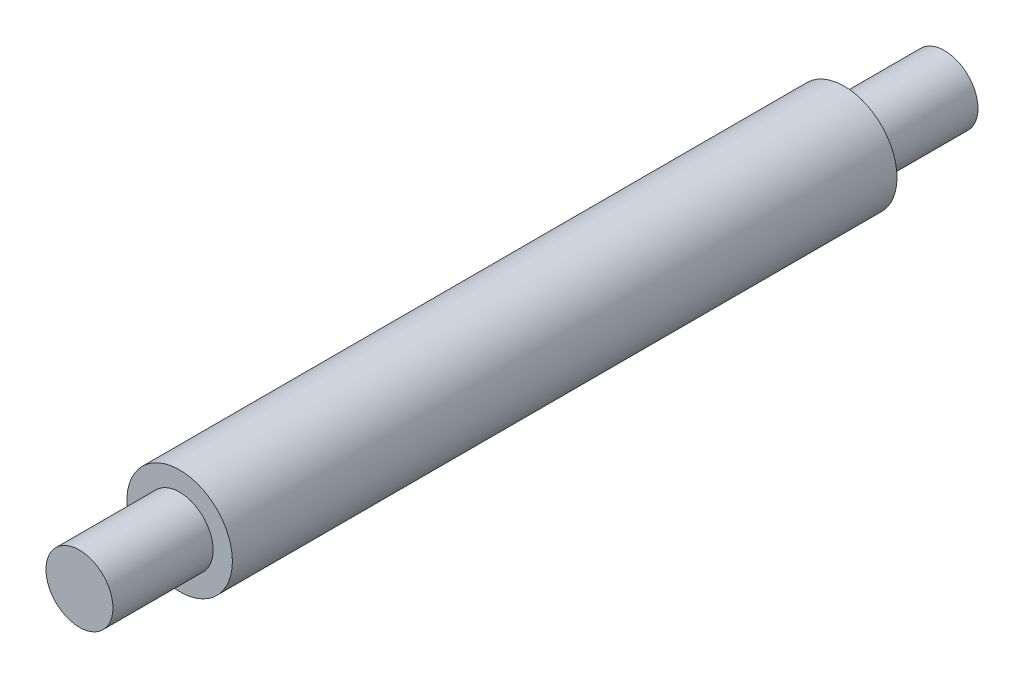
ISO-10303-21;
HEADER;
FILE_DESCRIPTION(('STEP AP214'),'2;1');
FILE_NAME('part.step','',(''),(''),'','','');
FILE_SCHEMA(('AUTOMOTIVE_DESIGN { 1 0 10303 214 1 1 1 1 }'));
ENDSEC;
DATA;
#1=APPLICATION_CONTEXT('core data for automotive mechanical design processes');
#2=APPLICATION_PROTOCOL_DEFINITION('international standard','automotive_design',2000,#1);
#3=PRODUCT_CONTEXT('',#1,'mechanical');
#4=PRODUCT('Part','Part','',(#3));
#5=PRODUCT_RELATED_PRODUCT_CATEGORY('part','',(#4));
#6=PRODUCT_DEFINITION_FORMATION('','',#4);
#7=PRODUCT_DEFINITION_CONTEXT('part definition',#1,'design');
#8=PRODUCT_DEFINITION('design','',#6,#7);
#9=PRODUCT_DEFINITION_SHAPE('','',#8);
#10=(LENGTH_UNIT() NAMED_UNIT(*) SI_UNIT(.MILLI.,.METRE.));
#11=(NAMED_UNIT(*) PLANE_ANGLE_UNIT() SI_UNIT($,.RADIAN.));
#12=(NAMED_UNIT(*) SI_UNIT($,.STERADIAN.) SOLID_ANGLE_UNIT());
#13=UNCERTAINTY_MEASURE_WITH_UNIT(LENGTH_MEASURE(1.E-05),#10,'distance_accuracy_value','');
#14=(GEOMETRIC_REPRESENTATION_CONTEXT(3) GLOBAL_UNCERTAINTY_ASSIGNED_CONTEXT((#13)) GLOBAL_UNIT_ASSIGNED_CONTEXT((#10,
#11,#12)) REPRESENTATION_CONTEXT('',''));
#15=CARTESIAN_POINT('',(0.,0.,0.));
#16=DIRECTION('',(0.,0.,1.));
#17=DIRECTION('',(1.,0.,0.));
#18=AXIS2_PLACEMENT_3D('',#15,#16,#17);
#19=CARTESIAN_POINT('',(0.,0.,31.5));
#20=DIRECTION('',(0.,0.,-1.));
#21=DIRECTION('',(-1.,0.,0.));
#22=AXIS2_PLACEMENT_3D('',#19,#20,#21);
#23=CYLINDRICAL_SURFACE('',#22,5.);
#24=CARTESIAN_POINT('',(0.,0.,31.5));
#25=DIRECTION('',(0.,0.,1.));
#26=DIRECTION('',(1.,0.,0.));
#27=AXIS2_PLACEMENT_3D('',#24,#25,#26);
#28=CIRCLE('',#27,5.);
#29=CARTESIAN_POINT('',(5.,0.,31.5));
#30=VERTEX_POINT('',#29);
#31=EDGE_CURVE('E11',#30,#30,#28,.T.);
#32=ORIENTED_EDGE('',*,*,#31,.F.);
#33=EDGE_LOOP('',(#32));
#34=FACE_BOUND('',#33,.T.);
#35=CARTESIAN_POINT('',(0.,0.,-31.5));
#36=DIRECTION('',(0.,0.,1.));
#37=DIRECTION('',(1.,0.,0.));
#38=AXIS2_PLACEMENT_3D('',#35,#36,#37);
#39=CIRCLE('',#38,5.);
#40=CARTESIAN_POINT('',(5.,0.,-31.5));
#41=VERTEX_POINT('',#40);
#42=EDGE_CURVE('E44',#41,#41,#39,.T.);
#43=ORIENTED_EDGE('',*,*,#42,.T.);
#44=EDGE_LOOP('',(#43));
#45=FACE_BOUND('',#44,.T.);
#46=ADVANCED_FACE('F41',(#34,#45),#23,.T.);
#47=CARTESIAN_POINT('',(0.,0.,31.5));
#48=DIRECTION('',(0.,0.,1.));
#49=DIRECTION('',(1.,0.,0.));
#50=AXIS2_PLACEMENT_3D('',#47,#48,#49);
#51=PLANE('',#50);
#52=ORIENTED_EDGE('',*,*,#31,.T.);
#53=EDGE_LOOP('',(#52));
#54=FACE_BOUND('',#53,.T.);
#55=ADVANCED_FACE('F56',(#54),#51,.T.);
#56=CARTESIAN_POINT('',(0.,0.,-31.5));
#57=DIRECTION('',(0.,0.,1.));
#58=DIRECTION('',(1.,0.,0.));
#59=AXIS2_PLACEMENT_3D('',#56,#57,#58);
#60=PLANE('',#59);
#61=ORIENTED_EDGE('',*,*,#42,.F.);
#62=EDGE_LOOP('',(#61));
#63=FACE_BOUND('',#62,.T.);
#64=ADVANCED_FACE('F54',(#63),#60,.F.);
#65=CLOSED_SHELL('',(#46,#55,#64));
#66=MANIFOLD_SOLID_BREP('B2',#65);
#67=CARTESIAN_POINT('',(0.,0.,41.));
#68=DIRECTION('',(0.,0.,-1.));
#69=DIRECTION('',(-1.,0.,0.));
#70=AXIS2_PLACEMENT_3D('',#67,#68,#69);
#71=CYLINDRICAL_SURFACE('',#70,3.175);
#72=CARTESIAN_POINT('',(0.,0.,41.));
#73=DIRECTION('',(0.,0.,1.));
#74=DIRECTION('',(1.,0.,0.));
#75=AXIS2_PLACEMENT_3D('',#72,#73,#74);
#76=CIRCLE('',#75,3.175);
#77=CARTESIAN_POINT('',(3.175,0.,41.));
#78=VERTEX_POINT('',#77);
#79=EDGE_CURVE('E40',#78,#78,#76,.T.);
#80=ORIENTED_EDGE('',*,*,#79,.F.);
#81=EDGE_LOOP('',(#80));
#82=FACE_BOUND('',#81,.T.);
#83=CARTESIAN_POINT('',(0.,0.,-41.));
#84=DIRECTION('',(0.,0.,1.));
#85=DIRECTION('',(1.,0.,0.));
#86=AXIS2_PLACEMENT_3D('',#83,#84,#85);
#87=CIRCLE('',#86,3.175);
#88=CARTESIAN_POINT('',(3.175,0.,-41.));
#89=VERTEX_POINT('',#88);
#90=EDGE_CURVE('E85',#89,#89,#87,.T.);
#91=ORIENTED_EDGE('',*,*,#90,.T.);
#92=EDGE_LOOP('',(#91));
#93=FACE_BOUND('',#92,.T.);
#94=ADVANCED_FACE('F82',(#82,#93),#71,.T.);
#95=CARTESIAN_POINT('',(0.,0.,41.));
#96=DIRECTION('',(0.,0.,1.));
#97=DIRECTION('',(1.,0.,0.));
#98=AXIS2_PLACEMENT_3D('',#95,#96,#97);
#99=PLANE('',#98);
#100=ORIENTED_EDGE('',*,*,#79,.T.);
#101=EDGE_LOOP('',(#100));
#102=FACE_BOUND('',#101,.T.);
#103=ADVANCED_FACE('F97',(#102),#99,.T.);
#104=CARTESIAN_POINT('',(0.,0.,-41.));
#105=DIRECTION('',(0.,0.,1.));
#106=DIRECTION('',(1.,0.,0.));
#107=AXIS2_PLACEMENT_3D('',#104,#105,#106);
#108=PLANE('',#107);
#109=ORIENTED_EDGE('',*,*,#90,.F.);
#110=EDGE_LOOP('',(#109));
#111=FACE_BOUND('',#110,.T.);
#112=ADVANCED_FACE('F95',(#111),#108,.F.);
#113=CLOSED_SHELL('',(#94,#103,#112));
#114=MANIFOLD_SOLID_BREP('B6',#113);
#115=ADVANCED_BREP_SHAPE_REPRESENTATION('',(#18,#66,#114),#14);
#116=SHAPE_DEFINITION_REPRESENTATION(#9,#115);
ENDSEC;
END-ISO-10303-21;
